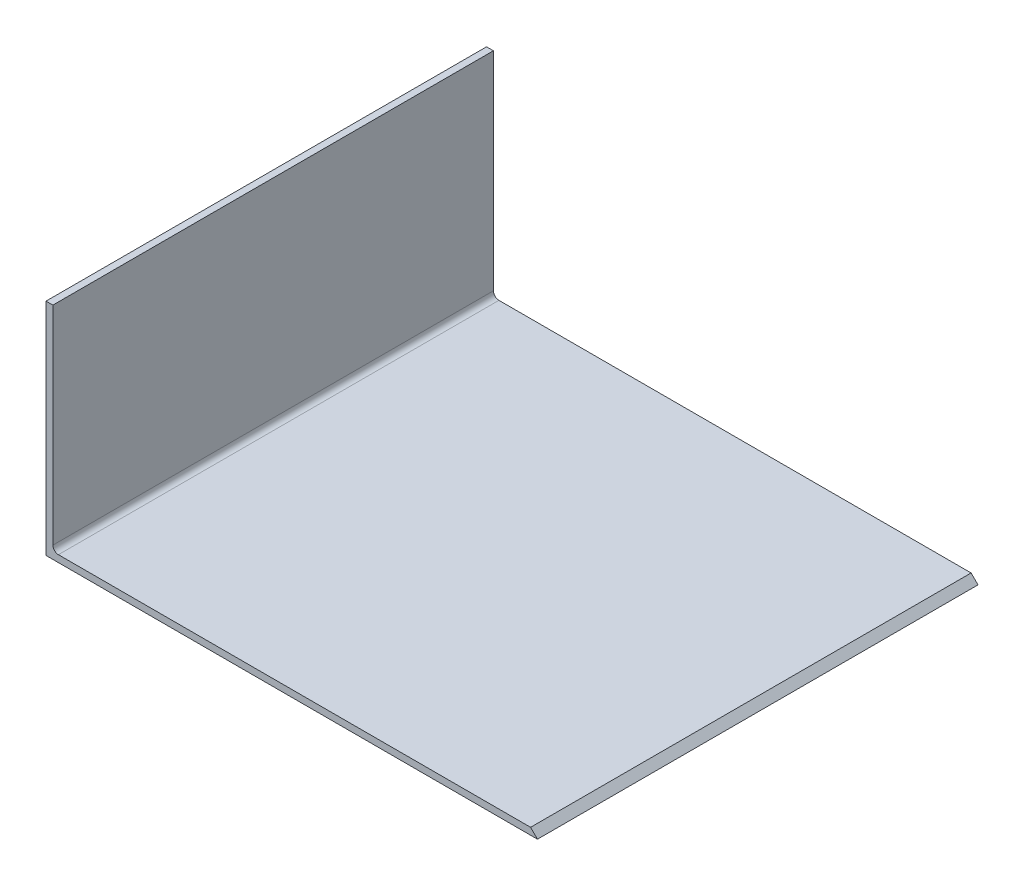
ISO-10303-21;
HEADER;
FILE_DESCRIPTION(('STEP AP214'),'2;1');
FILE_NAME('part.step','',(''),(''),'','','');
FILE_SCHEMA(('AUTOMOTIVE_DESIGN { 1 0 10303 214 1 1 1 1 }'));
ENDSEC;
DATA;
#1=APPLICATION_CONTEXT('core data for automotive mechanical design processes');
#2=APPLICATION_PROTOCOL_DEFINITION('international standard','automotive_design',2000,#1);
#3=PRODUCT_CONTEXT('',#1,'mechanical');
#4=PRODUCT('Part','Part','',(#3));
#5=PRODUCT_RELATED_PRODUCT_CATEGORY('part','',(#4));
#6=PRODUCT_DEFINITION_FORMATION('','',#4);
#7=PRODUCT_DEFINITION_CONTEXT('part definition',#1,'design');
#8=PRODUCT_DEFINITION('design','',#6,#7);
#9=PRODUCT_DEFINITION_SHAPE('','',#8);
#10=(LENGTH_UNIT() NAMED_UNIT(*) SI_UNIT(.MILLI.,.METRE.));
#11=(NAMED_UNIT(*) PLANE_ANGLE_UNIT() SI_UNIT($,.RADIAN.));
#12=(NAMED_UNIT(*) SI_UNIT($,.STERADIAN.) SOLID_ANGLE_UNIT());
#13=UNCERTAINTY_MEASURE_WITH_UNIT(LENGTH_MEASURE(1.E-05),#10,'distance_accuracy_value','');
#14=(GEOMETRIC_REPRESENTATION_CONTEXT(3) GLOBAL_UNCERTAINTY_ASSIGNED_CONTEXT((#13)) GLOBAL_UNIT_ASSIGNED_CONTEXT((#10,
#11,#12)) REPRESENTATION_CONTEXT('',''));
#15=CARTESIAN_POINT('',(0.,0.,0.));
#16=DIRECTION('',(0.,0.,1.));
#17=DIRECTION('',(1.,0.,0.));
#18=AXIS2_PLACEMENT_3D('',#15,#16,#17);
#19=CARTESIAN_POINT('',(5.715,2.54,101.6));
#20=DIRECTION('',(0.,0.,-1.));
#21=DIRECTION('',(-1.,0.,0.));
#22=AXIS2_PLACEMENT_3D('',#19,#20,#21);
#23=CYLINDRICAL_SURFACE('',#22,2.54);
#24=CARTESIAN_POINT('',(5.715,2.54,-101.6));
#25=DIRECTION('',(0.,0.,1.));
#26=DIRECTION('',(1.,0.,0.));
#27=AXIS2_PLACEMENT_3D('',#24,#25,#26);
#28=CIRCLE('',#27,2.54);
#29=CARTESIAN_POINT('',(3.175,2.54,-101.6));
#30=VERTEX_POINT('',#29);
#31=CARTESIAN_POINT('',(5.715,0.,-101.6));
#32=VERTEX_POINT('',#31);
#33=EDGE_CURVE('E99',#30,#32,#28,.T.);
#34=ORIENTED_EDGE('',*,*,#33,.F.);
#35=DIRECTION('',(0.,0.,-1.));
#36=VECTOR('',#35,1.);
#37=CARTESIAN_POINT('',(3.175,2.54,101.6));
#38=LINE('',#37,#36);
#39=CARTESIAN_POINT('',(3.175,2.54,101.6));
#40=VERTEX_POINT('',#39);
#41=EDGE_CURVE('E93',#40,#30,#38,.T.);
#42=ORIENTED_EDGE('',*,*,#41,.F.);
#43=CARTESIAN_POINT('',(5.715,2.54,101.6));
#44=DIRECTION('',(0.,0.,1.));
#45=DIRECTION('',(1.,0.,0.));
#46=AXIS2_PLACEMENT_3D('',#43,#44,#45);
#47=CIRCLE('',#46,2.54);
#48=CARTESIAN_POINT('',(5.715,0.,101.6));
#49=VERTEX_POINT('',#48);
#50=EDGE_CURVE('E96',#40,#49,#47,.T.);
#51=ORIENTED_EDGE('',*,*,#50,.T.);
#52=DIRECTION('',(0.,0.,-1.));
#53=VECTOR('',#52,1.);
#54=CARTESIAN_POINT('',(5.715,0.,101.6));
#55=LINE('',#54,#53);
#56=EDGE_CURVE('E128',#49,#32,#55,.T.);
#57=ORIENTED_EDGE('',*,*,#56,.T.);
#58=EDGE_LOOP('',(#34,#42,#51,#57));
#59=FACE_BOUND('',#58,.T.);
#60=ADVANCED_FACE('F34',(#59),#23,.F.);
#61=CARTESIAN_POINT('',(3.175,0.,101.6));
#62=DIRECTION('',(-1.,0.,0.));
#63=DIRECTION('',(0.,0.,1.));
#64=AXIS2_PLACEMENT_3D('',#61,#62,#63);
#65=PLANE('',#64);
#66=DIRECTION('',(0.,1.,0.));
#67=VECTOR('',#66,1.);
#68=CARTESIAN_POINT('',(3.175,0.,-101.6));
#69=LINE('',#68,#67);
#70=CARTESIAN_POINT('',(3.175,98.425,-101.6));
#71=VERTEX_POINT('',#70);
#72=EDGE_CURVE('E130',#30,#71,#69,.T.);
#73=ORIENTED_EDGE('',*,*,#72,.T.);
#74=DIRECTION('',(0.,0.,-1.));
#75=VECTOR('',#74,1.);
#76=CARTESIAN_POINT('',(3.175,98.425,101.6));
#77=LINE('',#76,#75);
#78=CARTESIAN_POINT('',(3.175,98.425,101.6));
#79=VERTEX_POINT('',#78);
#80=EDGE_CURVE('E104',#79,#71,#77,.T.);
#81=ORIENTED_EDGE('',*,*,#80,.F.);
#82=DIRECTION('',(0.,1.,0.));
#83=VECTOR('',#82,1.);
#84=CARTESIAN_POINT('',(3.175,0.,101.6));
#85=LINE('',#84,#83);
#86=EDGE_CURVE('E107',#40,#79,#85,.T.);
#87=ORIENTED_EDGE('',*,*,#86,.F.);
#88=ORIENTED_EDGE('',*,*,#41,.T.);
#89=EDGE_LOOP('',(#73,#81,#87,#88));
#90=FACE_BOUND('',#89,.T.);
#91=ADVANCED_FACE('F108',(#90),#65,.F.);
#92=CARTESIAN_POINT('',(0.,98.425,101.6));
#93=DIRECTION('',(0.,1.,0.));
#94=DIRECTION('',(0.,0.,1.));
#95=AXIS2_PLACEMENT_3D('',#92,#93,#94);
#96=PLANE('',#95);
#97=DIRECTION('',(1.,0.,0.));
#98=VECTOR('',#97,1.);
#99=CARTESIAN_POINT('',(0.,98.425,-101.6));
#100=LINE('',#99,#98);
#101=CARTESIAN_POINT('',(0.,98.425,-101.6));
#102=VERTEX_POINT('',#101);
#103=EDGE_CURVE('E132',#102,#71,#100,.T.);
#104=ORIENTED_EDGE('',*,*,#103,.F.);
#105=DIRECTION('',(0.,0.,-1.));
#106=VECTOR('',#105,1.);
#107=CARTESIAN_POINT('',(0.,98.425,101.6));
#108=LINE('',#107,#106);
#109=CARTESIAN_POINT('',(0.,98.425,101.6));
#110=VERTEX_POINT('',#109);
#111=EDGE_CURVE('E142',#110,#102,#108,.T.);
#112=ORIENTED_EDGE('',*,*,#111,.F.);
#113=DIRECTION('',(1.,0.,0.));
#114=VECTOR('',#113,1.);
#115=CARTESIAN_POINT('',(0.,98.425,101.6));
#116=LINE('',#115,#114);
#117=EDGE_CURVE('E112',#110,#79,#116,.T.);
#118=ORIENTED_EDGE('',*,*,#117,.T.);
#119=ORIENTED_EDGE('',*,*,#80,.T.);
#120=EDGE_LOOP('',(#104,#112,#118,#119));
#121=FACE_BOUND('',#120,.T.);
#122=ADVANCED_FACE('F157',(#121),#96,.T.);
#123=CARTESIAN_POINT('',(0.,0.,101.6));
#124=DIRECTION('',(1.,0.,0.));
#125=DIRECTION('',(0.,1.,0.));
#126=AXIS2_PLACEMENT_3D('',#123,#124,#125);
#127=PLANE('',#126);
#128=DIRECTION('',(0.,-1.,0.));
#129=VECTOR('',#128,1.);
#130=CARTESIAN_POINT('',(0.,0.,-101.6));
#131=LINE('',#130,#129);
#132=CARTESIAN_POINT('',(0.,-3.175,-101.6));
#133=VERTEX_POINT('',#132);
#134=EDGE_CURVE('E135',#102,#133,#131,.T.);
#135=ORIENTED_EDGE('',*,*,#134,.T.);
#136=DIRECTION('',(0.,0.,-1.));
#137=VECTOR('',#136,1.);
#138=CARTESIAN_POINT('',(0.,-3.175,101.6));
#139=LINE('',#138,#137);
#140=CARTESIAN_POINT('',(0.,-3.175,101.6));
#141=VERTEX_POINT('',#140);
#142=EDGE_CURVE('E139',#141,#133,#139,.T.);
#143=ORIENTED_EDGE('',*,*,#142,.F.);
#144=DIRECTION('',(0.,-1.,0.));
#145=VECTOR('',#144,1.);
#146=CARTESIAN_POINT('',(0.,0.,101.6));
#147=LINE('',#146,#145);
#148=EDGE_CURVE('E123',#110,#141,#147,.T.);
#149=ORIENTED_EDGE('',*,*,#148,.F.);
#150=ORIENTED_EDGE('',*,*,#111,.T.);
#151=EDGE_LOOP('',(#135,#143,#149,#150));
#152=FACE_BOUND('',#151,.T.);
#153=ADVANCED_FACE('F161',(#152),#127,.F.);
#154=CARTESIAN_POINT('',(0.,-3.175,101.6));
#155=DIRECTION('',(0.,1.,0.));
#156=DIRECTION('',(0.,0.,1.));
#157=AXIS2_PLACEMENT_3D('',#154,#155,#156);
#158=PLANE('',#157);
#159=DIRECTION('',(1.,0.,0.));
#160=VECTOR('',#159,1.);
#161=CARTESIAN_POINT('',(0.,-3.175,-101.6));
#162=LINE('',#161,#160);
#163=CARTESIAN_POINT('',(226.695,-3.175,-101.6));
#164=VERTEX_POINT('',#163);
#165=EDGE_CURVE('E119',#133,#164,#162,.T.);
#166=ORIENTED_EDGE('',*,*,#165,.T.);
#167=DIRECTION('',(0.,0.,-1.));
#168=VECTOR('',#167,1.);
#169=CARTESIAN_POINT('',(226.695,-3.175,101.6));
#170=LINE('',#169,#168);
#171=CARTESIAN_POINT('',(226.695,-3.175,101.6));
#172=VERTEX_POINT('',#171);
#173=EDGE_CURVE('E42',#164,#172,#170,.F.);
#174=ORIENTED_EDGE('',*,*,#173,.T.);
#175=DIRECTION('',(1.,0.,0.));
#176=VECTOR('',#175,1.);
#177=CARTESIAN_POINT('',(0.,-3.175,101.6));
#178=LINE('',#177,#176);
#179=EDGE_CURVE('E125',#141,#172,#178,.T.);
#180=ORIENTED_EDGE('',*,*,#179,.F.);
#181=ORIENTED_EDGE('',*,*,#142,.T.);
#182=EDGE_LOOP('',(#166,#174,#180,#181));
#183=FACE_BOUND('',#182,.T.);
#184=ADVANCED_FACE('F162',(#183),#158,.F.);
#185=CARTESIAN_POINT('',(0.,0.,101.6));
#186=DIRECTION('',(0.,1.,0.));
#187=DIRECTION('',(0.,0.,1.));
#188=AXIS2_PLACEMENT_3D('',#185,#186,#187);
#189=PLANE('',#188);
#190=DIRECTION('',(1.,0.,0.));
#191=VECTOR('',#190,1.);
#192=CARTESIAN_POINT('',(0.,0.,101.6));
#193=LINE('',#192,#191);
#194=CARTESIAN_POINT('',(223.52,0.,101.6));
#195=VERTEX_POINT('',#194);
#196=EDGE_CURVE('E116',#49,#195,#193,.T.);
#197=ORIENTED_EDGE('',*,*,#196,.T.);
#198=DIRECTION('',(0.,0.,-1.));
#199=VECTOR('',#198,1.);
#200=CARTESIAN_POINT('',(223.52,0.,101.6));
#201=LINE('',#200,#199);
#202=CARTESIAN_POINT('',(223.52,0.,-101.6));
#203=VERTEX_POINT('',#202);
#204=EDGE_CURVE('E103',#195,#203,#201,.T.);
#205=ORIENTED_EDGE('',*,*,#204,.T.);
#206=DIRECTION('',(1.,0.,0.));
#207=VECTOR('',#206,1.);
#208=CARTESIAN_POINT('',(0.,0.,-101.6));
#209=LINE('',#208,#207);
#210=EDGE_CURVE('E117',#32,#203,#209,.T.);
#211=ORIENTED_EDGE('',*,*,#210,.F.);
#212=ORIENTED_EDGE('',*,*,#56,.F.);
#213=EDGE_LOOP('',(#197,#205,#211,#212));
#214=FACE_BOUND('',#213,.T.);
#215=ADVANCED_FACE('F150',(#214),#189,.T.);
#216=CARTESIAN_POINT('',(0.,0.,101.6));
#217=DIRECTION('',(0.,0.,1.));
#218=DIRECTION('',(1.,0.,0.));
#219=AXIS2_PLACEMENT_3D('',#216,#217,#218);
#220=PLANE('',#219);
#221=ORIENTED_EDGE('',*,*,#179,.T.);
#222=DIRECTION('',(0.707106781186551,-0.707106781186544,0.));
#223=VECTOR('',#222,1.);
#224=CARTESIAN_POINT('',(111.759999999999,111.76,101.6));
#225=LINE('',#224,#223);
#226=EDGE_CURVE('E11',#172,#195,#225,.F.);
#227=ORIENTED_EDGE('',*,*,#226,.T.);
#228=ORIENTED_EDGE('',*,*,#196,.F.);
#229=ORIENTED_EDGE('',*,*,#50,.F.);
#230=ORIENTED_EDGE('',*,*,#86,.T.);
#231=ORIENTED_EDGE('',*,*,#117,.F.);
#232=ORIENTED_EDGE('',*,*,#148,.T.);
#233=EDGE_LOOP('',(#221,#227,#228,#229,#230,#231,#232));
#234=FACE_BOUND('',#233,.T.);
#235=ADVANCED_FACE('F114',(#234),#220,.T.);
#236=CARTESIAN_POINT('',(0.,0.,-101.6));
#237=DIRECTION('',(0.,0.,1.));
#238=DIRECTION('',(1.,0.,0.));
#239=AXIS2_PLACEMENT_3D('',#236,#237,#238);
#240=PLANE('',#239);
#241=ORIENTED_EDGE('',*,*,#210,.T.);
#242=DIRECTION('',(-0.707106781186551,0.707106781186544,0.));
#243=VECTOR('',#242,1.);
#244=CARTESIAN_POINT('',(223.52,0.,-101.6));
#245=LINE('',#244,#243);
#246=EDGE_CURVE('E56',#203,#164,#245,.F.);
#247=ORIENTED_EDGE('',*,*,#246,.T.);
#248=ORIENTED_EDGE('',*,*,#165,.F.);
#249=ORIENTED_EDGE('',*,*,#134,.F.);
#250=ORIENTED_EDGE('',*,*,#103,.T.);
#251=ORIENTED_EDGE('',*,*,#72,.F.);
#252=ORIENTED_EDGE('',*,*,#33,.T.);
#253=EDGE_LOOP('',(#241,#247,#248,#249,#250,#251,#252));
#254=FACE_BOUND('',#253,.T.);
#255=ADVANCED_FACE('F153',(#254),#240,.F.);
#256=CARTESIAN_POINT('',(223.52,0.,101.6));
#257=DIRECTION('',(-0.707106781186544,-0.707106781186551,0.));
#258=DIRECTION('',(0.,0.,-1.));
#259=AXIS2_PLACEMENT_3D('',#256,#257,#258);
#260=PLANE('',#259);
#261=ORIENTED_EDGE('',*,*,#226,.F.);
#262=ORIENTED_EDGE('',*,*,#173,.F.);
#263=ORIENTED_EDGE('',*,*,#246,.F.);
#264=ORIENTED_EDGE('',*,*,#204,.F.);
#265=EDGE_LOOP('',(#261,#262,#263,#264));
#266=FACE_BOUND('',#265,.T.);
#267=ADVANCED_FACE('F36',(#266),#260,.F.);
#268=CLOSED_SHELL('',(#60,#91,#122,#153,#184,#215,#235,#255,#267));
#269=MANIFOLD_SOLID_BREP('B2',#268);
#270=ADVANCED_BREP_SHAPE_REPRESENTATION('',(#18,#269),#14);
#271=SHAPE_DEFINITION_REPRESENTATION(#9,#270);
ENDSEC;
END-ISO-10303-21;
